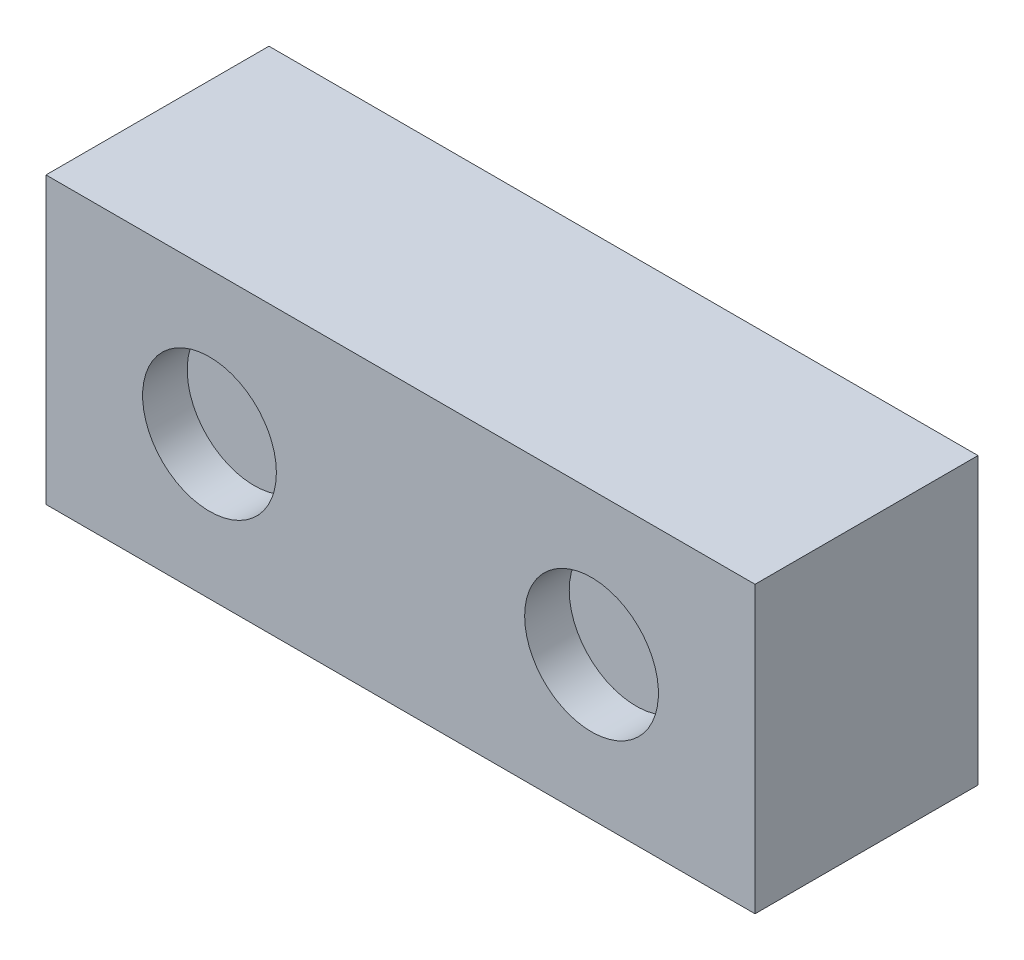
ISO-10303-21;
HEADER;
FILE_DESCRIPTION(('STEP AP214'),'2;1');
FILE_NAME('part.step','',(''),(''),'','','');
FILE_SCHEMA(('AUTOMOTIVE_DESIGN { 1 0 10303 214 1 1 1 1 }'));
ENDSEC;
DATA;
#1=APPLICATION_CONTEXT('core data for automotive mechanical design processes');
#2=APPLICATION_PROTOCOL_DEFINITION('international standard','automotive_design',2000,#1);
#3=PRODUCT_CONTEXT('',#1,'mechanical');
#4=PRODUCT('Part','Part','',(#3));
#5=PRODUCT_RELATED_PRODUCT_CATEGORY('part','',(#4));
#6=PRODUCT_DEFINITION_FORMATION('','',#4);
#7=PRODUCT_DEFINITION_CONTEXT('part definition',#1,'design');
#8=PRODUCT_DEFINITION('design','',#6,#7);
#9=PRODUCT_DEFINITION_SHAPE('','',#8);
#10=(LENGTH_UNIT() NAMED_UNIT(*) SI_UNIT(.MILLI.,.METRE.));
#11=(NAMED_UNIT(*) PLANE_ANGLE_UNIT() SI_UNIT($,.RADIAN.));
#12=(NAMED_UNIT(*) SI_UNIT($,.STERADIAN.) SOLID_ANGLE_UNIT());
#13=UNCERTAINTY_MEASURE_WITH_UNIT(LENGTH_MEASURE(1.E-05),#10,'distance_accuracy_value','');
#14=(GEOMETRIC_REPRESENTATION_CONTEXT(3) GLOBAL_UNCERTAINTY_ASSIGNED_CONTEXT((#13)) GLOBAL_UNIT_ASSIGNED_CONTEXT((#10,
#11,#12)) REPRESENTATION_CONTEXT('',''));
#15=CARTESIAN_POINT('',(0.,0.,0.));
#16=DIRECTION('',(0.,0.,1.));
#17=DIRECTION('',(1.,0.,0.));
#18=AXIS2_PLACEMENT_3D('',#15,#16,#17);
#19=CARTESIAN_POINT('',(15.9,6.4,10.));
#20=DIRECTION('',(-1.,0.,0.));
#21=DIRECTION('',(0.,0.,1.));
#22=AXIS2_PLACEMENT_3D('',#19,#20,#21);
#23=PLANE('',#22);
#24=DIRECTION('',(0.,1.,0.));
#25=VECTOR('',#24,1.);
#26=CARTESIAN_POINT('',(15.9,6.4,0.));
#27=LINE('',#26,#25);
#28=CARTESIAN_POINT('',(15.9,-6.4,0.));
#29=VERTEX_POINT('',#28);
#30=CARTESIAN_POINT('',(15.9,6.4,0.));
#31=VERTEX_POINT('',#30);
#32=EDGE_CURVE('E113',#29,#31,#27,.T.);
#33=ORIENTED_EDGE('',*,*,#32,.T.);
#34=DIRECTION('',(0.,0.,-1.));
#35=VECTOR('',#34,1.);
#36=CARTESIAN_POINT('',(15.9,6.4,10.));
#37=LINE('',#36,#35);
#38=CARTESIAN_POINT('',(15.9,6.4,10.));
#39=VERTEX_POINT('',#38);
#40=EDGE_CURVE('E11',#39,#31,#37,.T.);
#41=ORIENTED_EDGE('',*,*,#40,.F.);
#42=DIRECTION('',(0.,1.,0.));
#43=VECTOR('',#42,1.);
#44=CARTESIAN_POINT('',(15.9,6.4,10.));
#45=LINE('',#44,#43);
#46=CARTESIAN_POINT('',(15.9,-6.4,10.));
#47=VERTEX_POINT('',#46);
#48=EDGE_CURVE('E97',#47,#39,#45,.T.);
#49=ORIENTED_EDGE('',*,*,#48,.F.);
#50=DIRECTION('',(0.,0.,-1.));
#51=VECTOR('',#50,1.);
#52=CARTESIAN_POINT('',(15.9,-6.4,10.));
#53=LINE('',#52,#51);
#54=EDGE_CURVE('E109',#47,#29,#53,.T.);
#55=ORIENTED_EDGE('',*,*,#54,.T.);
#56=EDGE_LOOP('',(#33,#41,#49,#55));
#57=FACE_BOUND('',#56,.T.);
#58=ADVANCED_FACE('F45',(#57),#23,.F.);
#59=CARTESIAN_POINT('',(-15.9,6.4,10.));
#60=DIRECTION('',(0.,-1.,0.));
#61=DIRECTION('',(0.,0.,-1.));
#62=AXIS2_PLACEMENT_3D('',#59,#60,#61);
#63=PLANE('',#62);
#64=DIRECTION('',(-1.,0.,0.));
#65=VECTOR('',#64,1.);
#66=CARTESIAN_POINT('',(-15.9,6.4,0.));
#67=LINE('',#66,#65);
#68=CARTESIAN_POINT('',(-15.9,6.4,0.));
#69=VERTEX_POINT('',#68);
#70=EDGE_CURVE('E102',#31,#69,#67,.T.);
#71=ORIENTED_EDGE('',*,*,#70,.T.);
#72=DIRECTION('',(0.,0.,-1.));
#73=VECTOR('',#72,1.);
#74=CARTESIAN_POINT('',(-15.9,6.4,10.));
#75=LINE('',#74,#73);
#76=CARTESIAN_POINT('',(-15.9,6.4,10.));
#77=VERTEX_POINT('',#76);
#78=EDGE_CURVE('E54',#77,#69,#75,.T.);
#79=ORIENTED_EDGE('',*,*,#78,.F.);
#80=DIRECTION('',(-1.,0.,0.));
#81=VECTOR('',#80,1.);
#82=CARTESIAN_POINT('',(-15.9,6.4,10.));
#83=LINE('',#82,#81);
#84=EDGE_CURVE('E92',#39,#77,#83,.T.);
#85=ORIENTED_EDGE('',*,*,#84,.F.);
#86=ORIENTED_EDGE('',*,*,#40,.T.);
#87=EDGE_LOOP('',(#71,#79,#85,#86));
#88=FACE_BOUND('',#87,.T.);
#89=ADVANCED_FACE('F101',(#88),#63,.F.);
#90=CARTESIAN_POINT('',(-15.9,6.4,10.));
#91=DIRECTION('',(1.,0.,0.));
#92=DIRECTION('',(0.,0.,-1.));
#93=AXIS2_PLACEMENT_3D('',#90,#91,#92);
#94=PLANE('',#93);
#95=DIRECTION('',(0.,-1.,0.));
#96=VECTOR('',#95,1.);
#97=CARTESIAN_POINT('',(-15.9,6.4,0.));
#98=LINE('',#97,#96);
#99=CARTESIAN_POINT('',(-15.9,-6.4,0.));
#100=VERTEX_POINT('',#99);
#101=EDGE_CURVE('E79',#69,#100,#98,.T.);
#102=ORIENTED_EDGE('',*,*,#101,.T.);
#103=DIRECTION('',(0.,0.,-1.));
#104=VECTOR('',#103,1.);
#105=CARTESIAN_POINT('',(-15.9,-6.4,10.));
#106=LINE('',#105,#104);
#107=CARTESIAN_POINT('',(-15.9,-6.4,10.));
#108=VERTEX_POINT('',#107);
#109=EDGE_CURVE('E104',#108,#100,#106,.T.);
#110=ORIENTED_EDGE('',*,*,#109,.F.);
#111=DIRECTION('',(0.,-1.,0.));
#112=VECTOR('',#111,1.);
#113=CARTESIAN_POINT('',(-15.9,6.4,10.));
#114=LINE('',#113,#112);
#115=EDGE_CURVE('E95',#77,#108,#114,.T.);
#116=ORIENTED_EDGE('',*,*,#115,.F.);
#117=ORIENTED_EDGE('',*,*,#78,.T.);
#118=EDGE_LOOP('',(#102,#110,#116,#117));
#119=FACE_BOUND('',#118,.T.);
#120=ADVANCED_FACE('F105',(#119),#94,.F.);
#121=CARTESIAN_POINT('',(-15.9,-6.4,10.));
#122=DIRECTION('',(0.,1.,0.));
#123=DIRECTION('',(0.,0.,1.));
#124=AXIS2_PLACEMENT_3D('',#121,#122,#123);
#125=PLANE('',#124);
#126=DIRECTION('',(1.,0.,0.));
#127=VECTOR('',#126,1.);
#128=CARTESIAN_POINT('',(-15.9,-6.4,0.));
#129=LINE('',#128,#127);
#130=EDGE_CURVE('E85',#100,#29,#129,.T.);
#131=ORIENTED_EDGE('',*,*,#130,.T.);
#132=ORIENTED_EDGE('',*,*,#54,.F.);
#133=DIRECTION('',(1.,0.,0.));
#134=VECTOR('',#133,1.);
#135=CARTESIAN_POINT('',(-15.9,-6.4,10.));
#136=LINE('',#135,#134);
#137=EDGE_CURVE('E62',#108,#47,#136,.T.);
#138=ORIENTED_EDGE('',*,*,#137,.F.);
#139=ORIENTED_EDGE('',*,*,#109,.T.);
#140=EDGE_LOOP('',(#131,#132,#138,#139));
#141=FACE_BOUND('',#140,.T.);
#142=ADVANCED_FACE('F127',(#141),#125,.F.);
#143=CARTESIAN_POINT('',(0.,0.,10.));
#144=DIRECTION('',(0.,0.,1.));
#145=DIRECTION('',(1.,0.,0.));
#146=AXIS2_PLACEMENT_3D('',#143,#144,#145);
#147=PLANE('',#146);
#148=CARTESIAN_POINT('',(8.56708441305874,0.,10.));
#149=DIRECTION('',(0.,0.,-1.));
#150=DIRECTION('',(-1.,0.,0.));
#151=AXIS2_PLACEMENT_3D('',#148,#149,#150);
#152=CIRCLE('',#151,3.);
#153=CARTESIAN_POINT('',(5.56708441305874,0.,10.));
#154=VERTEX_POINT('',#153);
#155=EDGE_CURVE('E142',#154,#154,#152,.T.);
#156=ORIENTED_EDGE('',*,*,#155,.T.);
#157=EDGE_LOOP('',(#156));
#158=FACE_BOUND('',#157,.T.);
#159=CARTESIAN_POINT('',(-8.56708441305874,0.,10.));
#160=DIRECTION('',(0.,0.,1.));
#161=DIRECTION('',(1.,0.,0.));
#162=AXIS2_PLACEMENT_3D('',#159,#160,#161);
#163=CIRCLE('',#162,3.);
#164=CARTESIAN_POINT('',(-5.56708441305874,0.,10.));
#165=VERTEX_POINT('',#164);
#166=EDGE_CURVE('E134',#165,#165,#163,.T.);
#167=ORIENTED_EDGE('',*,*,#166,.F.);
#168=EDGE_LOOP('',(#167));
#169=FACE_BOUND('',#168,.T.);
#170=ORIENTED_EDGE('',*,*,#48,.T.);
#171=ORIENTED_EDGE('',*,*,#84,.T.);
#172=ORIENTED_EDGE('',*,*,#115,.T.);
#173=ORIENTED_EDGE('',*,*,#137,.T.);
#174=EDGE_LOOP('',(#170,#171,#172,#173));
#175=FACE_BOUND('',#174,.T.);
#176=ADVANCED_FACE('F93',(#158,#169,#175),#147,.T.);
#177=CARTESIAN_POINT('',(0.,0.,0.));
#178=DIRECTION('',(0.,0.,1.));
#179=DIRECTION('',(1.,0.,0.));
#180=AXIS2_PLACEMENT_3D('',#177,#178,#179);
#181=PLANE('',#180);
#182=ORIENTED_EDGE('',*,*,#32,.F.);
#183=ORIENTED_EDGE('',*,*,#130,.F.);
#184=ORIENTED_EDGE('',*,*,#101,.F.);
#185=ORIENTED_EDGE('',*,*,#70,.F.);
#186=EDGE_LOOP('',(#182,#183,#184,#185));
#187=FACE_BOUND('',#186,.T.);
#188=ADVANCED_FACE('F130',(#187),#181,.F.);
#189=CARTESIAN_POINT('',(-8.56708441305874,0.,8.));
#190=DIRECTION('',(0.,0.,1.));
#191=DIRECTION('',(1.,0.,0.));
#192=AXIS2_PLACEMENT_3D('',#189,#190,#191);
#193=CYLINDRICAL_SURFACE('',#192,3.);
#194=CARTESIAN_POINT('',(-8.56708441305874,0.,8.));
#195=DIRECTION('',(0.,0.,1.));
#196=DIRECTION('',(1.,0.,0.));
#197=AXIS2_PLACEMENT_3D('',#194,#195,#196);
#198=CIRCLE('',#197,3.);
#199=CARTESIAN_POINT('',(-5.56708441305874,0.,8.));
#200=VERTEX_POINT('',#199);
#201=EDGE_CURVE('E117',#200,#200,#198,.T.);
#202=ORIENTED_EDGE('',*,*,#201,.F.);
#203=EDGE_LOOP('',(#202));
#204=FACE_BOUND('',#203,.T.);
#205=ORIENTED_EDGE('',*,*,#166,.T.);
#206=EDGE_LOOP('',(#205));
#207=FACE_BOUND('',#206,.T.);
#208=ADVANCED_FACE('F174',(#204,#207),#193,.F.);
#209=CARTESIAN_POINT('',(-8.56708441305874,0.,8.));
#210=DIRECTION('',(0.,0.,1.));
#211=DIRECTION('',(1.,0.,0.));
#212=AXIS2_PLACEMENT_3D('',#209,#210,#211);
#213=PLANE('',#212);
#214=ORIENTED_EDGE('',*,*,#201,.T.);
#215=EDGE_LOOP('',(#214));
#216=FACE_BOUND('',#215,.T.);
#217=ADVANCED_FACE('F159',(#216),#213,.T.);
#218=CARTESIAN_POINT('',(8.56708441305874,0.,8.));
#219=DIRECTION('',(0.,0.,1.));
#220=DIRECTION('',(1.,0.,0.));
#221=AXIS2_PLACEMENT_3D('',#218,#219,#220);
#222=CYLINDRICAL_SURFACE('',#221,3.);
#223=CARTESIAN_POINT('',(8.56708441305874,0.,8.));
#224=DIRECTION('',(0.,0.,-1.));
#225=DIRECTION('',(-1.,0.,0.));
#226=AXIS2_PLACEMENT_3D('',#223,#224,#225);
#227=CIRCLE('',#226,3.);
#228=CARTESIAN_POINT('',(5.56708441305874,0.,8.));
#229=VERTEX_POINT('',#228);
#230=EDGE_CURVE('E138',#229,#229,#227,.T.);
#231=ORIENTED_EDGE('',*,*,#230,.T.);
#232=EDGE_LOOP('',(#231));
#233=FACE_BOUND('',#232,.T.);
#234=ORIENTED_EDGE('',*,*,#155,.F.);
#235=EDGE_LOOP('',(#234));
#236=FACE_BOUND('',#235,.T.);
#237=ADVANCED_FACE('F150',(#233,#236),#222,.F.);
#238=CARTESIAN_POINT('',(8.56708441305874,0.,8.));
#239=DIRECTION('',(0.,0.,1.));
#240=DIRECTION('',(-1.,0.,0.));
#241=AXIS2_PLACEMENT_3D('',#238,#239,#240);
#242=PLANE('',#241);
#243=ORIENTED_EDGE('',*,*,#230,.F.);
#244=EDGE_LOOP('',(#243));
#245=FACE_BOUND('',#244,.T.);
#246=ADVANCED_FACE('F153',(#245),#242,.T.);
#247=CLOSED_SHELL('',(#58,#89,#120,#142,#176,#188,#208,#217,#237,#246));
#248=MANIFOLD_SOLID_BREP('B2',#247);
#249=ADVANCED_BREP_SHAPE_REPRESENTATION('',(#18,#248),#14);
#250=SHAPE_DEFINITION_REPRESENTATION(#9,#249);
ENDSEC;
END-ISO-10303-21;
